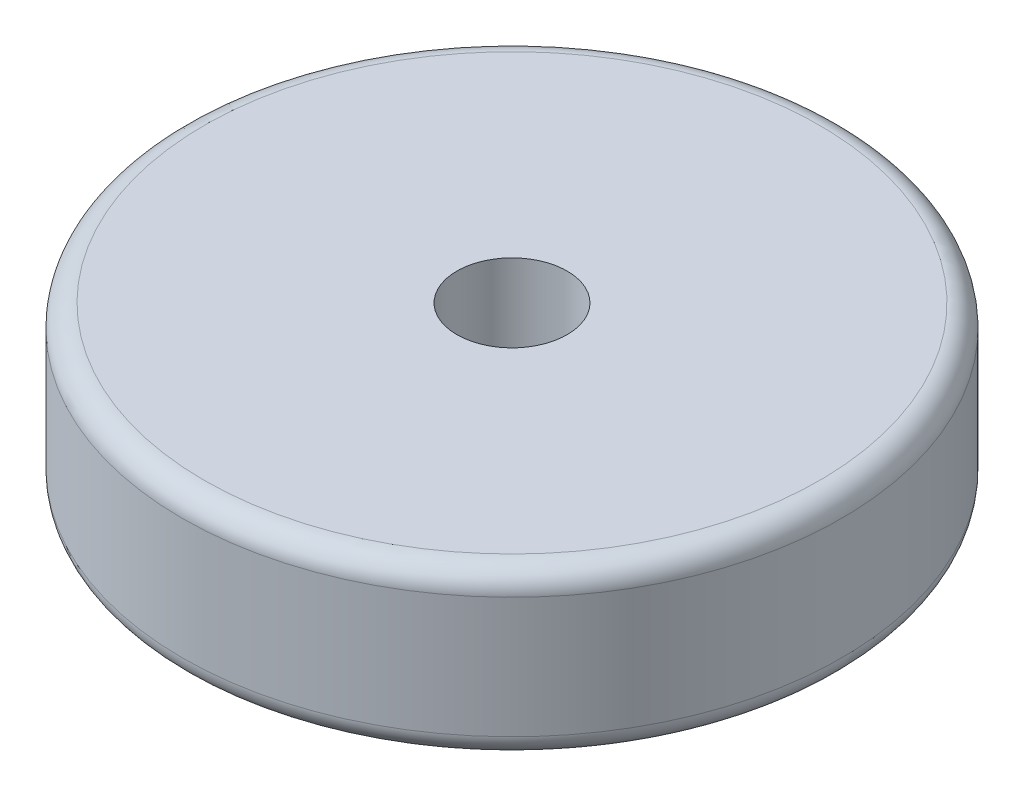
ISO-10303-21;
HEADER;
FILE_DESCRIPTION(('STEP AP214'),'2;1');
FILE_NAME('part.step','',(''),(''),'','','');
FILE_SCHEMA(('AUTOMOTIVE_DESIGN { 1 0 10303 214 1 1 1 1 }'));
ENDSEC;
DATA;
#1=APPLICATION_CONTEXT('core data for automotive mechanical design processes');
#2=APPLICATION_PROTOCOL_DEFINITION('international standard','automotive_design',2000,#1);
#3=PRODUCT_CONTEXT('',#1,'mechanical');
#4=PRODUCT('Part','Part','',(#3));
#5=PRODUCT_RELATED_PRODUCT_CATEGORY('part','',(#4));
#6=PRODUCT_DEFINITION_FORMATION('','',#4);
#7=PRODUCT_DEFINITION_CONTEXT('part definition',#1,'design');
#8=PRODUCT_DEFINITION('design','',#6,#7);
#9=PRODUCT_DEFINITION_SHAPE('','',#8);
#10=(LENGTH_UNIT() NAMED_UNIT(*) SI_UNIT(.MILLI.,.METRE.));
#11=(NAMED_UNIT(*) PLANE_ANGLE_UNIT() SI_UNIT($,.RADIAN.));
#12=(NAMED_UNIT(*) SI_UNIT($,.STERADIAN.) SOLID_ANGLE_UNIT());
#13=UNCERTAINTY_MEASURE_WITH_UNIT(LENGTH_MEASURE(1.E-05),#10,'distance_accuracy_value','');
#14=(GEOMETRIC_REPRESENTATION_CONTEXT(3) GLOBAL_UNCERTAINTY_ASSIGNED_CONTEXT((#13)) GLOBAL_UNIT_ASSIGNED_CONTEXT((#10,
#11,#12)) REPRESENTATION_CONTEXT('',''));
#15=CARTESIAN_POINT('',(0.,0.,0.));
#16=DIRECTION('',(0.,0.,1.));
#17=DIRECTION('',(1.,0.,0.));
#18=AXIS2_PLACEMENT_3D('',#15,#16,#17);
#19=CARTESIAN_POINT('',(0.,38.1,0.));
#20=DIRECTION('',(0.,-1.,0.));
#21=DIRECTION('',(0.,0.,-1.));
#22=AXIS2_PLACEMENT_3D('',#19,#20,#21);
#23=CYLINDRICAL_SURFACE('',#22,76.2352794398783);
#24=CARTESIAN_POINT('',(0.,5.08,0.));
#25=DIRECTION('',(0.,1.,0.));
#26=DIRECTION('',(0.,0.,1.));
#27=AXIS2_PLACEMENT_3D('',#24,#25,#26);
#28=CIRCLE('',#27,76.2352794398783);
#29=CARTESIAN_POINT('',(0.,5.08,-76.2352794398783));
#30=VERTEX_POINT('',#29);
#31=EDGE_CURVE('E42',#30,#30,#28,.T.);
#32=CARTESIAN_POINT('',(0.,33.02,0.));
#33=DIRECTION('',(0.,1.,0.));
#34=DIRECTION('',(0.,0.,1.));
#35=AXIS2_PLACEMENT_3D('',#32,#33,#34);
#36=CIRCLE('',#35,76.2352794398783);
#37=CARTESIAN_POINT('',(0.,33.02,-76.2352794398783));
#38=VERTEX_POINT('',#37);
#39=EDGE_CURVE('E46',#38,#38,#36,.F.);
#40=CARTESIAN_POINT('',(0.,5.08,-76.2352794398783));
#41=CARTESIAN_POINT('',(0.,5.37104166666667,-76.2352794398783));
#42=CARTESIAN_POINT('',(0.,5.66208333333334,-76.2352794398783));
#43=CARTESIAN_POINT('',(0.,6.24416666666667,-76.2352794398783));
#44=CARTESIAN_POINT('',(0.,6.53520833333333,-76.2352794398783));
#45=CARTESIAN_POINT('',(0.,7.11729166666666,-76.2352794398783));
#46=CARTESIAN_POINT('',(0.,7.40833333333333,-76.2352794398783));
#47=CARTESIAN_POINT('',(0.,7.99041666666666,-76.2352794398783));
#48=CARTESIAN_POINT('',(0.,8.28145833333333,-76.2352794398783));
#49=CARTESIAN_POINT('',(0.,8.86354166666666,-76.2352794398783));
#50=CARTESIAN_POINT('',(0.,9.15458333333333,-76.2352794398783));
#51=CARTESIAN_POINT('',(0.,9.73666666666667,-76.2352794398783));
#52=CARTESIAN_POINT('',(0.,10.0277083333333,-76.2352794398783));
#53=CARTESIAN_POINT('',(0.,10.6097916666667,-76.2352794398783));
#54=CARTESIAN_POINT('',(0.,10.9008333333333,-76.2352794398783));
#55=CARTESIAN_POINT('',(0.,11.4829166666667,-76.2352794398783));
#56=CARTESIAN_POINT('',(0.,11.7739583333333,-76.2352794398783));
#57=CARTESIAN_POINT('',(0.,12.3560416666667,-76.2352794398783));
#58=CARTESIAN_POINT('',(0.,12.6470833333333,-76.2352794398783));
#59=CARTESIAN_POINT('',(0.,13.2291666666667,-76.2352794398783));
#60=CARTESIAN_POINT('',(0.,13.5202083333333,-76.2352794398783));
#61=CARTESIAN_POINT('',(0.,14.1022916666667,-76.2352794398783));
#62=CARTESIAN_POINT('',(0.,14.3933333333333,-76.2352794398783));
#63=CARTESIAN_POINT('',(0.,14.9754166666667,-76.2352794398783));
#64=CARTESIAN_POINT('',(0.,15.2664583333333,-76.2352794398783));
#65=CARTESIAN_POINT('',(0.,15.8485416666667,-76.2352794398783));
#66=CARTESIAN_POINT('',(0.,16.1395833333333,-76.2352794398783));
#67=CARTESIAN_POINT('',(0.,16.7216666666667,-76.2352794398783));
#68=CARTESIAN_POINT('',(0.,17.0127083333333,-76.2352794398783));
#69=CARTESIAN_POINT('',(0.,17.5947916666667,-76.2352794398783));
#70=CARTESIAN_POINT('',(0.,17.8858333333333,-76.2352794398783));
#71=CARTESIAN_POINT('',(0.,18.4679166666667,-76.2352794398783));
#72=CARTESIAN_POINT('',(0.,18.7589583333333,-76.2352794398783));
#73=CARTESIAN_POINT('',(0.,19.3410416666667,-76.2352794398783));
#74=CARTESIAN_POINT('',(0.,19.6320833333333,-76.2352794398783));
#75=CARTESIAN_POINT('',(0.,20.2141666666667,-76.2352794398783));
#76=CARTESIAN_POINT('',(0.,20.5052083333333,-76.2352794398783));
#77=CARTESIAN_POINT('',(0.,21.0872916666667,-76.2352794398783));
#78=CARTESIAN_POINT('',(0.,21.3783333333333,-76.2352794398783));
#79=CARTESIAN_POINT('',(0.,21.9604166666667,-76.2352794398783));
#80=CARTESIAN_POINT('',(0.,22.2514583333333,-76.2352794398783));
#81=CARTESIAN_POINT('',(0.,22.8335416666667,-76.2352794398783));
#82=CARTESIAN_POINT('',(0.,23.1245833333333,-76.2352794398783));
#83=CARTESIAN_POINT('',(0.,23.7066666666667,-76.2352794398783));
#84=CARTESIAN_POINT('',(0.,23.9977083333333,-76.2352794398783));
#85=CARTESIAN_POINT('',(0.,24.5797916666667,-76.2352794398783));
#86=CARTESIAN_POINT('',(0.,24.8708333333333,-76.2352794398783));
#87=CARTESIAN_POINT('',(0.,25.4529166666667,-76.2352794398783));
#88=CARTESIAN_POINT('',(0.,25.7439583333333,-76.2352794398783));
#89=CARTESIAN_POINT('',(0.,26.3260416666667,-76.2352794398783));
#90=CARTESIAN_POINT('',(0.,26.6170833333333,-76.2352794398783));
#91=CARTESIAN_POINT('',(0.,27.1991666666667,-76.2352794398783));
#92=CARTESIAN_POINT('',(0.,27.4902083333333,-76.2352794398783));
#93=CARTESIAN_POINT('',(0.,28.0722916666667,-76.2352794398783));
#94=CARTESIAN_POINT('',(0.,28.3633333333333,-76.2352794398783));
#95=CARTESIAN_POINT('',(0.,28.9454166666667,-76.2352794398783));
#96=CARTESIAN_POINT('',(0.,29.2364583333333,-76.2352794398783));
#97=CARTESIAN_POINT('',(0.,29.8185416666667,-76.2352794398783));
#98=CARTESIAN_POINT('',(0.,30.1095833333333,-76.2352794398783));
#99=CARTESIAN_POINT('',(0.,30.6916666666667,-76.2352794398783));
#100=CARTESIAN_POINT('',(0.,30.9827083333333,-76.2352794398783));
#101=CARTESIAN_POINT('',(0.,31.5647916666667,-76.2352794398783));
#102=CARTESIAN_POINT('',(0.,31.8558333333333,-76.2352794398783));
#103=CARTESIAN_POINT('',(0.,32.4379166666667,-76.2352794398783));
#104=CARTESIAN_POINT('',(0.,32.7289583333333,-76.2352794398783));
#105=CARTESIAN_POINT('',(0.,33.02,-76.2352794398783));
#106=B_SPLINE_CURVE_WITH_KNOTS('',3,(#40,#41,#42,#43,#44,#45,#46,#47,#48,#49,#50,#51,#52,#53,
#54,#55,#56,#57,#58,#59,#60,#61,#62,#63,#64,#65,#66,#67,#68,#69,#70,#71,#72,#73,#74,#75,#76,#77,
#78,#79,#80,#81,#82,#83,#84,#85,#86,#87,#88,#89,#90,#91,#92,#93,#94,#95,#96,#97,#98,#99,#100,
#101,#102,#103,#104,#105),.UNSPECIFIED.,.F.,.F.,(4,2,2,2,2,2,2,2,2,2,2,2,2,2,2,2,2,2,2,2,2,2,2,
2,2,2,2,2,2,2,2,2,4),(0.,0.873125000000002,1.74625,2.619375,3.4925,4.365625,5.23875,6.111875,
6.985,7.858125,8.73125,9.604375,10.4775,11.350625,12.22375,13.096875,13.97,14.843125,15.71625,
16.589375,17.4625,18.335625,19.20875,20.081875,20.955,21.828125,22.70125,23.574375,24.4475,
25.320625,26.19375,27.066875,27.94),.UNSPECIFIED.);
#107=EDGE_CURVE('BSEAM31',#30,#38,#106,.T.);
#108=ORIENTED_EDGE('',*,*,#31,.T.);
#109=ORIENTED_EDGE('',*,*,#39,.T.);
#110=ORIENTED_EDGE('',*,*,#107,.T.);
#111=ORIENTED_EDGE('',*,*,#107,.F.);
#112=EDGE_LOOP('',(#108,#110,#109,#111));
#113=FACE_BOUND('',#112,.T.);
#114=ADVANCED_FACE('F31',(#113),#23,.T.);
#115=CARTESIAN_POINT('',(0.,38.1,0.));
#116=DIRECTION('',(0.,1.,0.));
#117=DIRECTION('',(0.,0.,1.));
#118=AXIS2_PLACEMENT_3D('',#115,#116,#117);
#119=PLANE('',#118);
#120=CARTESIAN_POINT('',(0.,38.1,0.));
#121=DIRECTION('',(0.,1.,0.));
#122=DIRECTION('',(0.,0.,1.));
#123=AXIS2_PLACEMENT_3D('',#120,#121,#122);
#124=CIRCLE('',#123,71.1552794398783);
#125=CARTESIAN_POINT('',(0.,38.1,71.1552794398783));
#126=VERTEX_POINT('',#125);
#127=EDGE_CURVE('E10',#126,#126,#124,.T.);
#128=ORIENTED_EDGE('',*,*,#127,.T.);
#129=EDGE_LOOP('',(#128));
#130=FACE_BOUND('',#129,.T.);
#131=CARTESIAN_POINT('',(0.,38.1,0.));
#132=DIRECTION('',(0.,1.,0.));
#133=DIRECTION('',(0.,0.,1.));
#134=AXIS2_PLACEMENT_3D('',#131,#132,#133);
#135=CIRCLE('',#134,12.7579118711956);
#136=CARTESIAN_POINT('',(0.,38.1,12.7579118711956));
#137=VERTEX_POINT('',#136);
#138=EDGE_CURVE('E52',#137,#137,#135,.T.);
#139=ORIENTED_EDGE('',*,*,#138,.F.);
#140=EDGE_LOOP('',(#139));
#141=FACE_BOUND('',#140,.T.);
#142=ADVANCED_FACE('F67',(#130,#141),#119,.T.);
#143=CARTESIAN_POINT('',(0.,0.,0.));
#144=DIRECTION('',(0.,1.,0.));
#145=DIRECTION('',(0.,0.,1.));
#146=AXIS2_PLACEMENT_3D('',#143,#144,#145);
#147=PLANE('',#146);
#148=CARTESIAN_POINT('',(0.,0.,0.));
#149=DIRECTION('',(0.,1.,0.));
#150=DIRECTION('',(0.,0.,1.));
#151=AXIS2_PLACEMENT_3D('',#148,#149,#150);
#152=CIRCLE('',#151,71.1552794398783);
#153=CARTESIAN_POINT('',(0.,0.,71.1552794398783));
#154=VERTEX_POINT('',#153);
#155=EDGE_CURVE('E38',#154,#154,#152,.F.);
#156=ORIENTED_EDGE('',*,*,#155,.T.);
#157=EDGE_LOOP('',(#156));
#158=FACE_BOUND('',#157,.T.);
#159=CARTESIAN_POINT('',(0.,0.,0.));
#160=DIRECTION('',(0.,1.,0.));
#161=DIRECTION('',(0.,0.,1.));
#162=AXIS2_PLACEMENT_3D('',#159,#160,#161);
#163=CIRCLE('',#162,12.7579118711956);
#164=CARTESIAN_POINT('',(0.,0.,12.7579118711956));
#165=VERTEX_POINT('',#164);
#166=EDGE_CURVE('E51',#165,#165,#163,.T.);
#167=ORIENTED_EDGE('',*,*,#166,.T.);
#168=EDGE_LOOP('',(#167));
#169=FACE_BOUND('',#168,.T.);
#170=ADVANCED_FACE('F58',(#158,#169),#147,.F.);
#171=CARTESIAN_POINT('',(0.,0.,0.));
#172=DIRECTION('',(0.,1.,0.));
#173=DIRECTION('',(0.,0.,1.));
#174=AXIS2_PLACEMENT_3D('',#171,#172,#173);
#175=CYLINDRICAL_SURFACE('',#174,12.7579118711956);
#176=CARTESIAN_POINT('',(0.,0.,12.7579118711956));
#177=CARTESIAN_POINT('',(0.,0.396875,12.7579118711956));
#178=CARTESIAN_POINT('',(0.,0.79375,12.7579118711956));
#179=CARTESIAN_POINT('',(0.,1.5875,12.7579118711956));
#180=CARTESIAN_POINT('',(0.,1.984375,12.7579118711956));
#181=CARTESIAN_POINT('',(0.,2.778125,12.7579118711956));
#182=CARTESIAN_POINT('',(0.,3.175,12.7579118711956));
#183=CARTESIAN_POINT('',(0.,3.96875,12.7579118711956));
#184=CARTESIAN_POINT('',(0.,4.365625,12.7579118711956));
#185=CARTESIAN_POINT('',(0.,5.159375,12.7579118711956));
#186=CARTESIAN_POINT('',(0.,5.55625,12.7579118711956));
#187=CARTESIAN_POINT('',(0.,6.35,12.7579118711956));
#188=CARTESIAN_POINT('',(0.,6.746875,12.7579118711956));
#189=CARTESIAN_POINT('',(0.,7.540625,12.7579118711956));
#190=CARTESIAN_POINT('',(0.,7.9375,12.7579118711956));
#191=CARTESIAN_POINT('',(0.,8.73125,12.7579118711956));
#192=CARTESIAN_POINT('',(0.,9.128125,12.7579118711956));
#193=CARTESIAN_POINT('',(0.,9.921875,12.7579118711956));
#194=CARTESIAN_POINT('',(0.,10.31875,12.7579118711956));
#195=CARTESIAN_POINT('',(0.,11.1125,12.7579118711956));
#196=CARTESIAN_POINT('',(0.,11.509375,12.7579118711956));
#197=CARTESIAN_POINT('',(0.,12.303125,12.7579118711956));
#198=CARTESIAN_POINT('',(0.,12.7,12.7579118711956));
#199=CARTESIAN_POINT('',(0.,13.49375,12.7579118711956));
#200=CARTESIAN_POINT('',(0.,13.890625,12.7579118711956));
#201=CARTESIAN_POINT('',(0.,14.684375,12.7579118711956));
#202=CARTESIAN_POINT('',(0.,15.08125,12.7579118711956));
#203=CARTESIAN_POINT('',(0.,15.875,12.7579118711956));
#204=CARTESIAN_POINT('',(0.,16.271875,12.7579118711956));
#205=CARTESIAN_POINT('',(0.,17.065625,12.7579118711956));
#206=CARTESIAN_POINT('',(0.,17.4625,12.7579118711956));
#207=CARTESIAN_POINT('',(0.,18.25625,12.7579118711956));
#208=CARTESIAN_POINT('',(0.,18.653125,12.7579118711956));
#209=CARTESIAN_POINT('',(0.,19.446875,12.7579118711956));
#210=CARTESIAN_POINT('',(0.,19.84375,12.7579118711956));
#211=CARTESIAN_POINT('',(0.,20.6375,12.7579118711956));
#212=CARTESIAN_POINT('',(0.,21.034375,12.7579118711956));
#213=CARTESIAN_POINT('',(0.,21.828125,12.7579118711956));
#214=CARTESIAN_POINT('',(0.,22.225,12.7579118711956));
#215=CARTESIAN_POINT('',(0.,23.01875,12.7579118711956));
#216=CARTESIAN_POINT('',(0.,23.415625,12.7579118711956));
#217=CARTESIAN_POINT('',(0.,24.209375,12.7579118711956));
#218=CARTESIAN_POINT('',(0.,24.60625,12.7579118711956));
#219=CARTESIAN_POINT('',(0.,25.4,12.7579118711956));
#220=CARTESIAN_POINT('',(0.,25.796875,12.7579118711956));
#221=CARTESIAN_POINT('',(0.,26.590625,12.7579118711956));
#222=CARTESIAN_POINT('',(0.,26.9875,12.7579118711956));
#223=CARTESIAN_POINT('',(0.,27.78125,12.7579118711956));
#224=CARTESIAN_POINT('',(0.,28.178125,12.7579118711956));
#225=CARTESIAN_POINT('',(0.,28.971875,12.7579118711956));
#226=CARTESIAN_POINT('',(0.,29.36875,12.7579118711956));
#227=CARTESIAN_POINT('',(0.,30.1625,12.7579118711956));
#228=CARTESIAN_POINT('',(0.,30.559375,12.7579118711956));
#229=CARTESIAN_POINT('',(0.,31.353125,12.7579118711956));
#230=CARTESIAN_POINT('',(0.,31.75,12.7579118711956));
#231=CARTESIAN_POINT('',(0.,32.54375,12.7579118711956));
#232=CARTESIAN_POINT('',(0.,32.940625,12.7579118711956));
#233=CARTESIAN_POINT('',(0.,33.734375,12.7579118711956));
#234=CARTESIAN_POINT('',(0.,34.13125,12.7579118711956));
#235=CARTESIAN_POINT('',(0.,34.925,12.7579118711956));
#236=CARTESIAN_POINT('',(0.,35.321875,12.7579118711956));
#237=CARTESIAN_POINT('',(0.,36.115625,12.7579118711956));
#238=CARTESIAN_POINT('',(0.,36.5125,12.7579118711956));
#239=CARTESIAN_POINT('',(0.,37.30625,12.7579118711956));
#240=CARTESIAN_POINT('',(0.,37.703125,12.7579118711956));
#241=CARTESIAN_POINT('',(0.,38.1,12.7579118711956));
#242=B_SPLINE_CURVE_WITH_KNOTS('',3,(#176,#177,#178,#179,#180,#181,#182,#183,#184,#185,#186,
#187,#188,#189,#190,#191,#192,#193,#194,#195,#196,#197,#198,#199,#200,#201,#202,#203,#204,#205,
#206,#207,#208,#209,#210,#211,#212,#213,#214,#215,#216,#217,#218,#219,#220,#221,#222,#223,#224,
#225,#226,#227,#228,#229,#230,#231,#232,#233,#234,#235,#236,#237,#238,#239,#240,#241),
.UNSPECIFIED.,.F.,.F.,(4,2,2,2,2,2,2,2,2,2,2,2,2,2,2,2,2,2,2,2,2,2,2,2,2,2,2,2,2,2,2,2,4),(0.,
1.190625,2.38125,3.571875,4.7625,5.953125,7.14375,8.334375,9.525,10.715625,11.90625,13.096875,
14.2875,15.478125,16.66875,17.859375,19.05,20.240625,21.43125,22.621875,23.8125,25.003125,
26.19375,27.384375,28.575,29.765625,30.95625,32.146875,33.3375,34.528125,35.71875,36.909375,
38.1),.UNSPECIFIED.);
#243=EDGE_CURVE('BSEAM60',#165,#137,#242,.T.);
#244=ORIENTED_EDGE('',*,*,#166,.F.);
#245=ORIENTED_EDGE('',*,*,#138,.T.);
#246=ORIENTED_EDGE('',*,*,#243,.T.);
#247=ORIENTED_EDGE('',*,*,#243,.F.);
#248=EDGE_LOOP('',(#244,#246,#245,#247));
#249=FACE_BOUND('',#248,.T.);
#250=ADVANCED_FACE('F60',(#249),#175,.F.);
#251=CARTESIAN_POINT('',(0.,5.08,0.));
#252=DIRECTION('',(0.,1.,0.));
#253=DIRECTION('',(0.,0.,1.));
#254=AXIS2_PLACEMENT_3D('',#251,#252,#253);
#255=TOROIDAL_SURFACE('',#254,71.1552794398783,5.08);
#256=ORIENTED_EDGE('',*,*,#155,.F.);
#257=EDGE_LOOP('',(#256));
#258=FACE_BOUND('',#257,.T.);
#259=ORIENTED_EDGE('',*,*,#31,.F.);
#260=EDGE_LOOP('',(#259));
#261=FACE_BOUND('',#260,.T.);
#262=ADVANCED_FACE('F63',(#258,#261),#255,.T.);
#263=CARTESIAN_POINT('',(0.,33.02,0.));
#264=DIRECTION('',(0.,1.,0.));
#265=DIRECTION('',(0.,0.,1.));
#266=AXIS2_PLACEMENT_3D('',#263,#264,#265);
#267=TOROIDAL_SURFACE('',#266,71.1552794398783,5.08);
#268=ORIENTED_EDGE('',*,*,#39,.F.);
#269=EDGE_LOOP('',(#268));
#270=FACE_BOUND('',#269,.T.);
#271=ORIENTED_EDGE('',*,*,#127,.F.);
#272=EDGE_LOOP('',(#271));
#273=FACE_BOUND('',#272,.T.);
#274=ADVANCED_FACE('F33',(#270,#273),#267,.T.);
#275=CLOSED_SHELL('',(#114,#142,#170,#250,#262,#274));
#276=MANIFOLD_SOLID_BREP('B2',#275);
#277=ADVANCED_BREP_SHAPE_REPRESENTATION('',(#18,#276),#14);
#278=SHAPE_DEFINITION_REPRESENTATION(#9,#277);
ENDSEC;
END-ISO-10303-21;
